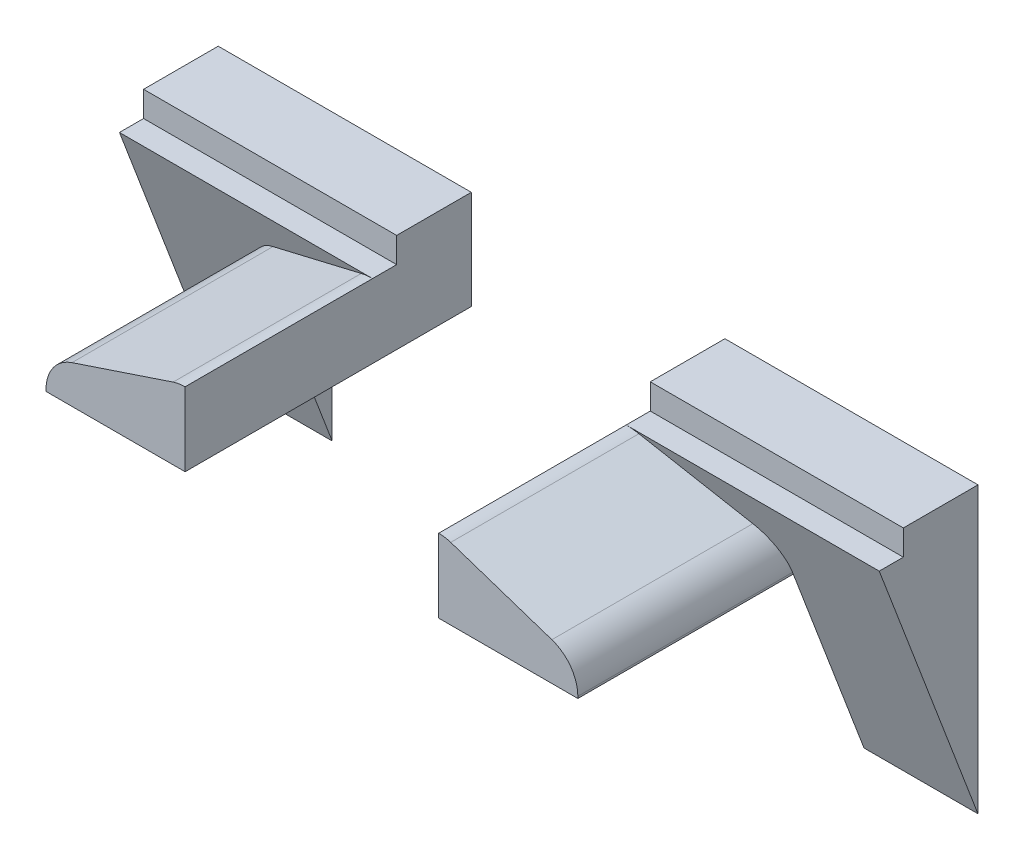
ISO-10303-21;
HEADER;
FILE_DESCRIPTION(('STEP AP214'),'2;1');
FILE_NAME('part.step','',(''),(''),'','','');
FILE_SCHEMA(('AUTOMOTIVE_DESIGN { 1 0 10303 214 1 1 1 1 }'));
ENDSEC;
DATA;
#1=APPLICATION_CONTEXT('core data for automotive mechanical design processes');
#2=APPLICATION_PROTOCOL_DEFINITION('international standard','automotive_design',2000,#1);
#3=PRODUCT_CONTEXT('',#1,'mechanical');
#4=PRODUCT('Part','Part','',(#3));
#5=PRODUCT_RELATED_PRODUCT_CATEGORY('part','',(#4));
#6=PRODUCT_DEFINITION_FORMATION('','',#4);
#7=PRODUCT_DEFINITION_CONTEXT('part definition',#1,'design');
#8=PRODUCT_DEFINITION('design','',#6,#7);
#9=PRODUCT_DEFINITION_SHAPE('','',#8);
#10=(LENGTH_UNIT() NAMED_UNIT(*) SI_UNIT(.MILLI.,.METRE.));
#11=(NAMED_UNIT(*) PLANE_ANGLE_UNIT() SI_UNIT($,.RADIAN.));
#12=(NAMED_UNIT(*) SI_UNIT($,.STERADIAN.) SOLID_ANGLE_UNIT());
#13=UNCERTAINTY_MEASURE_WITH_UNIT(LENGTH_MEASURE(1.E-05),#10,'distance_accuracy_value','');
#14=(GEOMETRIC_REPRESENTATION_CONTEXT(3) GLOBAL_UNCERTAINTY_ASSIGNED_CONTEXT((#13)) GLOBAL_UNIT_ASSIGNED_CONTEXT((#10,
#11,#12)) REPRESENTATION_CONTEXT('',''));
#15=CARTESIAN_POINT('',(0.,0.,0.));
#16=DIRECTION('',(0.,0.,1.));
#17=DIRECTION('',(1.,0.,0.));
#18=AXIS2_PLACEMENT_3D('',#15,#16,#17);
#19=CARTESIAN_POINT('',(300.,250.,226.));
#20=DIRECTION('',(0.,0.,-1.));
#21=DIRECTION('',(-1.,0.,0.));
#22=AXIS2_PLACEMENT_3D('',#19,#20,#21);
#23=PLANE('',#22);
#24=DIRECTION('',(1.,0.,0.));
#25=VECTOR('',#24,1.);
#26=CARTESIAN_POINT('',(210.,-53.1314680617709,226.));
#27=LINE('',#26,#25);
#28=CARTESIAN_POINT('',(-210.,-53.1314680617709,226.));
#29=VERTEX_POINT('',#28);
#30=CARTESIAN_POINT('',(-100.131670194949,-53.1314680617709,226.));
#31=VERTEX_POINT('',#30);
#32=EDGE_CURVE('E157',#29,#31,#27,.T.);
#33=ORIENTED_EDGE('',*,*,#32,.T.);
#34=DIRECTION('',(0.,1.,0.));
#35=VECTOR('',#34,1.);
#36=CARTESIAN_POINT('',(-100.131670194949,-14.05,226.));
#37=LINE('',#36,#35);
#38=CARTESIAN_POINT('',(-100.131670194949,4.99999999999998,226.));
#39=VERTEX_POINT('',#38);
#40=EDGE_CURVE('E65',#31,#39,#37,.T.);
#41=ORIENTED_EDGE('',*,*,#40,.T.);
#42=CARTESIAN_POINT('',(-100.131670194949,-25.,226.));
#43=DIRECTION('',(0.,0.,-1.));
#44=DIRECTION('',(-1.,0.,0.));
#45=AXIS2_PLACEMENT_3D('',#42,#43,#44);
#46=CIRCLE('',#45,30.);
#47=CARTESIAN_POINT('',(-109.618503175454,3.46049894151539,226.));
#48=VERTEX_POINT('',#47);
#49=EDGE_CURVE('E188',#48,#39,#46,.T.);
#50=ORIENTED_EDGE('',*,*,#49,.F.);
#51=DIRECTION('',(0.948683298050514,0.316227766016838,0.));
#52=VECTOR('',#51,1.);
#53=CARTESIAN_POINT('',(-105.,4.99999999999998,226.));
#54=LINE('',#53,#52);
#55=CARTESIAN_POINT('',(-189.486832980505,-23.1622776601684,226.));
#56=VERTEX_POINT('',#55);
#57=EDGE_CURVE('E182',#56,#48,#54,.T.);
#58=ORIENTED_EDGE('',*,*,#57,.F.);
#59=CARTESIAN_POINT('',(-180.,-51.6227766016838,226.));
#60=DIRECTION('',(0.,0.,-1.));
#61=DIRECTION('',(-1.,0.,0.));
#62=AXIS2_PLACEMENT_3D('',#59,#60,#61);
#63=CIRCLE('',#62,30.);
#64=CARTESIAN_POINT('',(-210.,-51.6227766016838,226.));
#65=VERTEX_POINT('',#64);
#66=EDGE_CURVE('E196',#65,#56,#63,.T.);
#67=ORIENTED_EDGE('',*,*,#66,.F.);
#68=DIRECTION('',(0.,-1.,0.));
#69=VECTOR('',#68,1.);
#70=CARTESIAN_POINT('',(-210.,0.,226.));
#71=LINE('',#70,#69);
#72=EDGE_CURVE('E131',#65,#29,#71,.T.);
#73=ORIENTED_EDGE('',*,*,#72,.T.);
#74=EDGE_LOOP('',(#33,#41,#50,#58,#67,#73));
#75=FACE_BOUND('',#74,.T.);
#76=ADVANCED_FACE('F43',(#75),#23,.F.);
#77=CARTESIAN_POINT('',(0.,0.,0.));
#78=DIRECTION('',(0.,0.,-1.));
#79=DIRECTION('',(-1.,0.,0.));
#80=AXIS2_PLACEMENT_3D('',#77,#78,#79);
#81=PLANE('',#80);
#82=DIRECTION('',(0.,-1.,0.));
#83=VECTOR('',#82,1.);
#84=CARTESIAN_POINT('',(-100.131670194949,-14.05,0.));
#85=LINE('',#84,#83);
#86=CARTESIAN_POINT('',(-100.131670194949,25.0000000000001,0.));
#87=VERTEX_POINT('',#86);
#88=CARTESIAN_POINT('',(-100.131670194949,-53.1314680617709,0.));
#89=VERTEX_POINT('',#88);
#90=EDGE_CURVE('E122',#87,#89,#85,.T.);
#91=ORIENTED_EDGE('',*,*,#90,.T.);
#92=DIRECTION('',(-1.,0.,0.));
#93=VECTOR('',#92,1.);
#94=CARTESIAN_POINT('',(210.,-53.1314680617709,0.));
#95=LINE('',#94,#93);
#96=CARTESIAN_POINT('',(-210.,-53.1314680617709,0.));
#97=VERTEX_POINT('',#96);
#98=EDGE_CURVE('E130',#89,#97,#95,.T.);
#99=ORIENTED_EDGE('',*,*,#98,.T.);
#100=DIRECTION('',(0.,-1.,0.));
#101=VECTOR('',#100,1.);
#102=CARTESIAN_POINT('',(-210.,-53.1314680617709,0.));
#103=LINE('',#102,#101);
#104=CARTESIAN_POINT('',(-210.,-200.,0.));
#105=VERTEX_POINT('',#104);
#106=EDGE_CURVE('E160',#97,#105,#103,.T.);
#107=ORIENTED_EDGE('',*,*,#106,.T.);
#108=DIRECTION('',(1.,0.,0.));
#109=VECTOR('',#108,1.);
#110=CARTESIAN_POINT('',(-300.,-200.,0.));
#111=LINE('',#110,#109);
#112=CARTESIAN_POINT('',(-300.,-200.,0.));
#113=VERTEX_POINT('',#112);
#114=EDGE_CURVE('E141',#113,#105,#111,.T.);
#115=ORIENTED_EDGE('',*,*,#114,.F.);
#116=DIRECTION('',(0.,-1.,0.));
#117=VECTOR('',#116,1.);
#118=CARTESIAN_POINT('',(-300.,-250.,0.));
#119=LINE('',#118,#117);
#120=CARTESIAN_POINT('',(-300.,25.0000000000001,0.));
#121=VERTEX_POINT('',#120);
#122=EDGE_CURVE('E147',#121,#113,#119,.T.);
#123=ORIENTED_EDGE('',*,*,#122,.F.);
#124=DIRECTION('',(-1.,0.,0.));
#125=VECTOR('',#124,1.);
#126=CARTESIAN_POINT('',(-300.,25.0000000000001,0.));
#127=LINE('',#126,#125);
#128=EDGE_CURVE('E137',#87,#121,#127,.T.);
#129=ORIENTED_EDGE('',*,*,#128,.F.);
#130=EDGE_LOOP('',(#91,#99,#107,#115,#123,#129));
#131=FACE_BOUND('',#130,.T.);
#132=ADVANCED_FACE('F144',(#131),#81,.T.);
#133=CARTESIAN_POINT('',(210.,-53.1314680617709,423.78807185347));
#134=DIRECTION('',(0.,-1.,0.));
#135=DIRECTION('',(0.,0.,-1.));
#136=AXIS2_PLACEMENT_3D('',#133,#134,#135);
#137=PLANE('',#136);
#138=DIRECTION('',(0.,0.,1.));
#139=VECTOR('',#138,1.);
#140=CARTESIAN_POINT('',(-100.131670194949,-53.1314680617709,0.));
#141=LINE('',#140,#139);
#142=EDGE_CURVE('E59',#89,#31,#141,.T.);
#143=ORIENTED_EDGE('',*,*,#142,.T.);
#144=ORIENTED_EDGE('',*,*,#32,.F.);
#145=DIRECTION('',(0.,0.,-1.));
#146=VECTOR('',#145,1.);
#147=CARTESIAN_POINT('',(-210.,-53.1314680617709,423.78807185347));
#148=LINE('',#147,#146);
#149=CARTESIAN_POINT('',(-210.,-53.131468061771,55.8816853228384));
#150=VERTEX_POINT('',#149);
#151=EDGE_CURVE('E166',#29,#150,#148,.T.);
#152=ORIENTED_EDGE('',*,*,#151,.T.);
#153=EDGE_CURVE('E153',#150,#97,#148,.T.);
#154=ORIENTED_EDGE('',*,*,#153,.T.);
#155=ORIENTED_EDGE('',*,*,#98,.F.);
#156=EDGE_LOOP('',(#143,#144,#152,#154,#155));
#157=FACE_BOUND('',#156,.T.);
#158=ADVANCED_FACE('F234',(#157),#137,.T.);
#159=CARTESIAN_POINT('',(-300.,25.0000000000001,886.018939122204));
#160=DIRECTION('',(0.,-1.,0.));
#161=DIRECTION('',(0.,0.,-1.));
#162=AXIS2_PLACEMENT_3D('',#159,#160,#161);
#163=PLANE('',#162);
#164=DIRECTION('',(1.,0.,0.));
#165=VECTOR('',#164,1.);
#166=CARTESIAN_POINT('',(-300.,25.0000000000001,58.9500000000001));
#167=LINE('',#166,#165);
#168=CARTESIAN_POINT('',(-300.,25.0000000000001,58.95));
#169=VERTEX_POINT('',#168);
#170=CARTESIAN_POINT('',(-100.131670194949,25.0000000000001,58.9500000000001));
#171=VERTEX_POINT('',#170);
#172=EDGE_CURVE('E139',#169,#171,#167,.T.);
#173=ORIENTED_EDGE('',*,*,#172,.T.);
#174=DIRECTION('',(0.,0.,1.));
#175=VECTOR('',#174,1.);
#176=CARTESIAN_POINT('',(-100.131670194949,25.0000000000001,0.));
#177=LINE('',#176,#175);
#178=EDGE_CURVE('E125',#87,#171,#177,.T.);
#179=ORIENTED_EDGE('',*,*,#178,.F.);
#180=ORIENTED_EDGE('',*,*,#128,.T.);
#181=DIRECTION('',(0.,0.,-1.));
#182=VECTOR('',#181,1.);
#183=CARTESIAN_POINT('',(-300.,25.0000000000001,886.018939122204));
#184=LINE('',#183,#182);
#185=EDGE_CURVE('E151',#169,#121,#184,.T.);
#186=ORIENTED_EDGE('',*,*,#185,.F.);
#187=EDGE_LOOP('',(#173,#179,#180,#186));
#188=FACE_BOUND('',#187,.T.);
#189=ADVANCED_FACE('F135',(#188),#163,.F.);
#190=CARTESIAN_POINT('',(0.,0.,58.95));
#191=DIRECTION('',(0.,0.,-1.));
#192=DIRECTION('',(-1.,0.,0.));
#193=AXIS2_PLACEMENT_3D('',#190,#191,#192);
#194=PLANE('',#193);
#195=DIRECTION('',(-1.,0.,0.));
#196=VECTOR('',#195,1.);
#197=CARTESIAN_POINT('',(-300.,5.0000000000001,58.95));
#198=LINE('',#197,#196);
#199=CARTESIAN_POINT('',(-100.131670194949,5.0000000000001,58.95));
#200=VERTEX_POINT('',#199);
#201=CARTESIAN_POINT('',(-300.,5.0000000000001,58.95));
#202=VERTEX_POINT('',#201);
#203=EDGE_CURVE('E46',#200,#202,#198,.T.);
#204=ORIENTED_EDGE('',*,*,#203,.F.);
#205=DIRECTION('',(0.,-1.,0.));
#206=VECTOR('',#205,1.);
#207=CARTESIAN_POINT('',(-100.131670194949,5.0000000000001,58.95));
#208=LINE('',#207,#206);
#209=EDGE_CURVE('E140',#171,#200,#208,.T.);
#210=ORIENTED_EDGE('',*,*,#209,.F.);
#211=ORIENTED_EDGE('',*,*,#172,.F.);
#212=DIRECTION('',(0.,1.,0.));
#213=VECTOR('',#212,1.);
#214=CARTESIAN_POINT('',(-300.,5.0000000000001,58.95));
#215=LINE('',#214,#213);
#216=EDGE_CURVE('E148',#202,#169,#215,.T.);
#217=ORIENTED_EDGE('',*,*,#216,.F.);
#218=EDGE_LOOP('',(#204,#210,#211,#217));
#219=FACE_BOUND('',#218,.T.);
#220=ADVANCED_FACE('F244',(#219),#194,.F.);
#221=CARTESIAN_POINT('',(-300.,-250.,886.018939122204));
#222=DIRECTION('',(1.,0.,0.));
#223=DIRECTION('',(0.,0.,-1.));
#224=AXIS2_PLACEMENT_3D('',#221,#222,#223);
#225=PLANE('',#224);
#226=DIRECTION('',(0.,0.,1.));
#227=VECTOR('',#226,1.);
#228=CARTESIAN_POINT('',(-300.,5.0000000000001,58.95));
#229=LINE('',#228,#227);
#230=CARTESIAN_POINT('',(-300.,5.0000000000001,78.));
#231=VERTEX_POINT('',#230);
#232=EDGE_CURVE('E171',#202,#231,#229,.T.);
#233=ORIENTED_EDGE('',*,*,#232,.F.);
#234=ORIENTED_EDGE('',*,*,#216,.T.);
#235=ORIENTED_EDGE('',*,*,#185,.T.);
#236=ORIENTED_EDGE('',*,*,#122,.T.);
#237=DIRECTION('',(0.,-0.934632107300073,-0.35561611887515));
#238=VECTOR('',#237,1.);
#239=CARTESIAN_POINT('',(-300.,-200.,0.));
#240=LINE('',#239,#238);
#241=EDGE_CURVE('E174',#231,#113,#240,.T.);
#242=ORIENTED_EDGE('',*,*,#241,.F.);
#243=EDGE_LOOP('',(#233,#234,#235,#236,#242));
#244=FACE_BOUND('',#243,.T.);
#245=ADVANCED_FACE('F246',(#244),#225,.F.);
#246=CARTESIAN_POINT('',(-210.,0.,226.));
#247=DIRECTION('',(1.,0.,0.));
#248=DIRECTION('',(0.,-1.,0.));
#249=AXIS2_PLACEMENT_3D('',#246,#247,#248);
#250=PLANE('',#249);
#251=ORIENTED_EDGE('',*,*,#151,.F.);
#252=ORIENTED_EDGE('',*,*,#72,.F.);
#253=DIRECTION('',(0.,0.,-1.));
#254=VECTOR('',#253,1.);
#255=CARTESIAN_POINT('',(-210.,-51.6227766016838,226.));
#256=LINE('',#255,#254);
#257=CARTESIAN_POINT('',(-210.,-51.6227766016838,56.4557240247252));
#258=VERTEX_POINT('',#257);
#259=EDGE_CURVE('E191',#258,#65,#256,.F.);
#260=ORIENTED_EDGE('',*,*,#259,.F.);
#261=DIRECTION('',(0.,-0.934632107300073,-0.35561611887515));
#262=VECTOR('',#261,1.);
#263=CARTESIAN_POINT('',(-210.,49.823110020994,95.0546467396953));
#264=LINE('',#263,#262);
#265=EDGE_CURVE('E185',#258,#150,#264,.T.);
#266=ORIENTED_EDGE('',*,*,#265,.T.);
#267=EDGE_LOOP('',(#251,#252,#260,#266));
#268=FACE_BOUND('',#267,.T.);
#269=ADVANCED_FACE('F231',(#268),#250,.F.);
#270=CARTESIAN_POINT('',(-100.131670194949,-25.,226.));
#271=DIRECTION('',(0.,0.,1.));
#272=DIRECTION('',(1.,0.,0.));
#273=AXIS2_PLACEMENT_3D('',#270,#271,#272);
#274=CYLINDRICAL_SURFACE('',#273,30.);
#275=ORIENTED_EDGE('',*,*,#49,.T.);
#276=DIRECTION('',(0.,0.,-1.));
#277=VECTOR('',#276,1.);
#278=CARTESIAN_POINT('',(-100.131670194949,4.99999999999998,78.));
#279=LINE('',#278,#277);
#280=CARTESIAN_POINT('',(-100.131670194949,5.00000000000005,78.0000000000001));
#281=VERTEX_POINT('',#280);
#282=EDGE_CURVE('E203',#39,#281,#279,.T.);
#283=ORIENTED_EDGE('',*,*,#282,.T.);
#284=CARTESIAN_POINT('',(-100.131670194949,-25.,66.5853658536585));
#285=DIRECTION('',(0.,-0.35561611887515,0.934632107300073));
#286=DIRECTION('',(0.,0.934632107300073,0.35561611887515));
#287=AXIS2_PLACEMENT_3D('',#284,#285,#286);
#288=ELLIPSE('',#287,32.0981911125039,30.);
#289=CARTESIAN_POINT('',(-109.618503175454,3.4604989415154,77.4142386216497));
#290=VERTEX_POINT('',#289);
#291=EDGE_CURVE('E197',#281,#290,#288,.T.);
#292=ORIENTED_EDGE('',*,*,#291,.T.);
#293=DIRECTION('',(0.,0.,-1.));
#294=VECTOR('',#293,1.);
#295=CARTESIAN_POINT('',(-109.618503175454,3.46049894151539,226.));
#296=LINE('',#295,#294);
#297=EDGE_CURVE('E194',#290,#48,#296,.F.);
#298=ORIENTED_EDGE('',*,*,#297,.T.);
#299=EDGE_LOOP('',(#275,#283,#292,#298));
#300=FACE_BOUND('',#299,.T.);
#301=ADVANCED_FACE('F216',(#300),#274,.T.);
#302=CARTESIAN_POINT('',(-180.,-51.6227766016838,226.));
#303=DIRECTION('',(0.,0.,-1.));
#304=DIRECTION('',(-1.,0.,0.));
#305=AXIS2_PLACEMENT_3D('',#302,#303,#304);
#306=CYLINDRICAL_SURFACE('',#305,30.);
#307=ORIENTED_EDGE('',*,*,#66,.T.);
#308=DIRECTION('',(0.,0.,-1.));
#309=VECTOR('',#308,1.);
#310=CARTESIAN_POINT('',(-189.486832980505,-23.1622776601684,226.));
#311=LINE('',#310,#309);
#312=CARTESIAN_POINT('',(-189.486832980505,-23.1622776601684,67.2845967927164));
#313=VERTEX_POINT('',#312);
#314=EDGE_CURVE('E198',#56,#313,#311,.T.);
#315=ORIENTED_EDGE('',*,*,#314,.T.);
#316=CARTESIAN_POINT('',(-180.,-51.6227766016838,56.4557240247251));
#317=DIRECTION('',(0.,-0.35561611887515,0.934632107300073));
#318=DIRECTION('',(0.,-0.934632107300073,-0.35561611887515));
#319=AXIS2_PLACEMENT_3D('',#316,#317,#318);
#320=ELLIPSE('',#319,32.0981911125039,30.);
#321=EDGE_CURVE('E201',#313,#258,#320,.T.);
#322=ORIENTED_EDGE('',*,*,#321,.T.);
#323=ORIENTED_EDGE('',*,*,#259,.T.);
#324=EDGE_LOOP('',(#307,#315,#322,#323));
#325=FACE_BOUND('',#324,.T.);
#326=ADVANCED_FACE('F226',(#325),#306,.T.);
#327=CARTESIAN_POINT('',(-105.,4.99999999999998,226.));
#328=DIRECTION('',(-0.316227766016838,0.948683298050514,0.));
#329=DIRECTION('',(0.948683298050514,0.316227766016838,0.));
#330=AXIS2_PLACEMENT_3D('',#327,#328,#329);
#331=PLANE('',#330);
#332=ORIENTED_EDGE('',*,*,#57,.T.);
#333=ORIENTED_EDGE('',*,*,#297,.F.);
#334=DIRECTION('',(0.94188988136698,0.313963293788993,0.119459204466056));
#335=VECTOR('',#334,1.);
#336=CARTESIAN_POINT('',(-88.3474224434364,10.5508591855212,80.1120342266861));
#337=LINE('',#336,#335);
#338=EDGE_CURVE('E177',#313,#290,#337,.T.);
#339=ORIENTED_EDGE('',*,*,#338,.F.);
#340=ORIENTED_EDGE('',*,*,#314,.F.);
#341=EDGE_LOOP('',(#332,#333,#339,#340));
#342=FACE_BOUND('',#341,.T.);
#343=ADVANCED_FACE('F222',(#342),#331,.T.);
#344=CARTESIAN_POINT('',(-300.,-200.,0.));
#345=DIRECTION('',(0.,-0.35561611887515,0.934632107300073));
#346=DIRECTION('',(0.,0.934632107300073,0.35561611887515));
#347=AXIS2_PLACEMENT_3D('',#344,#345,#346);
#348=PLANE('',#347);
#349=ORIENTED_EDGE('',*,*,#338,.T.);
#350=ORIENTED_EDGE('',*,*,#291,.F.);
#351=DIRECTION('',(1.,0.,0.));
#352=VECTOR('',#351,1.);
#353=CARTESIAN_POINT('',(-300.,5.0000000000001,78.));
#354=LINE('',#353,#352);
#355=EDGE_CURVE('E51',#231,#281,#354,.T.);
#356=ORIENTED_EDGE('',*,*,#355,.F.);
#357=ORIENTED_EDGE('',*,*,#241,.T.);
#358=ORIENTED_EDGE('',*,*,#114,.T.);
#359=EDGE_CURVE('E173',#150,#105,#264,.T.);
#360=ORIENTED_EDGE('',*,*,#359,.F.);
#361=ORIENTED_EDGE('',*,*,#265,.F.);
#362=ORIENTED_EDGE('',*,*,#321,.F.);
#363=EDGE_LOOP('',(#349,#350,#356,#357,#358,#360,#361,#362));
#364=FACE_BOUND('',#363,.T.);
#365=ADVANCED_FACE('F269',(#364),#348,.T.);
#366=CARTESIAN_POINT('',(-100.131670194949,-14.05,427.167363168382));
#367=DIRECTION('',(1.,0.,0.));
#368=DIRECTION('',(0.,0.,-1.));
#369=AXIS2_PLACEMENT_3D('',#366,#367,#368);
#370=PLANE('',#369);
#371=ORIENTED_EDGE('',*,*,#40,.F.);
#372=ORIENTED_EDGE('',*,*,#142,.F.);
#373=ORIENTED_EDGE('',*,*,#90,.F.);
#374=ORIENTED_EDGE('',*,*,#178,.T.);
#375=ORIENTED_EDGE('',*,*,#209,.T.);
#376=DIRECTION('',(0.,0.,-1.));
#377=VECTOR('',#376,1.);
#378=CARTESIAN_POINT('',(-100.131670194949,4.99999999999998,427.167363168382));
#379=LINE('',#378,#377);
#380=EDGE_CURVE('E12',#281,#200,#379,.T.);
#381=ORIENTED_EDGE('',*,*,#380,.F.);
#382=ORIENTED_EDGE('',*,*,#282,.F.);
#383=EDGE_LOOP('',(#371,#372,#373,#374,#375,#381,#382));
#384=FACE_BOUND('',#383,.T.);
#385=ADVANCED_FACE('F124',(#384),#370,.T.);
#386=CARTESIAN_POINT('',(-210.,-53.1314680617709,423.78807185347));
#387=DIRECTION('',(1.,0.,0.));
#388=DIRECTION('',(0.,1.,0.));
#389=AXIS2_PLACEMENT_3D('',#386,#387,#388);
#390=PLANE('',#389);
#391=ORIENTED_EDGE('',*,*,#106,.F.);
#392=ORIENTED_EDGE('',*,*,#153,.F.);
#393=ORIENTED_EDGE('',*,*,#359,.T.);
#394=EDGE_LOOP('',(#391,#392,#393));
#395=FACE_BOUND('',#394,.T.);
#396=ADVANCED_FACE('F236',(#395),#390,.T.);
#397=CARTESIAN_POINT('',(-300.,5.0000000000001,58.95));
#398=DIRECTION('',(0.,1.,0.));
#399=DIRECTION('',(0.,0.,-1.));
#400=AXIS2_PLACEMENT_3D('',#397,#398,#399);
#401=PLANE('',#400);
#402=ORIENTED_EDGE('',*,*,#203,.T.);
#403=ORIENTED_EDGE('',*,*,#232,.T.);
#404=ORIENTED_EDGE('',*,*,#355,.T.);
#405=ORIENTED_EDGE('',*,*,#380,.T.);
#406=EDGE_LOOP('',(#402,#403,#404,#405));
#407=FACE_BOUND('',#406,.T.);
#408=ADVANCED_FACE('F240',(#407),#401,.T.);
#409=CLOSED_SHELL('',(#76,#132,#158,#189,#220,#245,#269,#301,#326,#343,#365,#385,#396,#408));
#410=MANIFOLD_SOLID_BREP('B2',#409);
#411=CARTESIAN_POINT('',(105.,4.99999999999998,226.));
#412=DIRECTION('',(0.316227766016838,0.948683298050514,0.));
#413=DIRECTION('',(0.948683298050514,-0.316227766016838,0.));
#414=AXIS2_PLACEMENT_3D('',#411,#412,#413);
#415=PLANE('',#414);
#416=DIRECTION('',(0.94188988136698,-0.313963293788994,-0.119459204466056));
#417=VECTOR('',#416,1.);
#418=CARTESIAN_POINT('',(88.3474224434364,10.5508591855212,80.1120342266861));
#419=LINE('',#418,#417);
#420=CARTESIAN_POINT('',(109.618503175454,3.46049894151539,77.4142386216497));
#421=VERTEX_POINT('',#420);
#422=CARTESIAN_POINT('',(189.486832980505,-23.1622776601684,67.2845967927164));
#423=VERTEX_POINT('',#422);
#424=EDGE_CURVE('E442',#421,#423,#419,.T.);
#425=ORIENTED_EDGE('',*,*,#424,.F.);
#426=DIRECTION('',(0.,0.,-1.));
#427=VECTOR('',#426,1.);
#428=CARTESIAN_POINT('',(109.618503175454,3.46049894151539,78.));
#429=LINE('',#428,#427);
#430=CARTESIAN_POINT('',(109.618503175454,3.46049894151539,226.));
#431=VERTEX_POINT('',#430);
#432=EDGE_CURVE('E464',#431,#421,#429,.T.);
#433=ORIENTED_EDGE('',*,*,#432,.F.);
#434=DIRECTION('',(0.948683298050514,-0.316227766016838,0.));
#435=VECTOR('',#434,1.);
#436=CARTESIAN_POINT('',(105.,4.99999999999998,226.));
#437=LINE('',#436,#435);
#438=CARTESIAN_POINT('',(189.486832980505,-23.1622776601684,226.));
#439=VERTEX_POINT('',#438);
#440=EDGE_CURVE('E478',#431,#439,#437,.T.);
#441=ORIENTED_EDGE('',*,*,#440,.T.);
#442=DIRECTION('',(0.,0.,-1.));
#443=VECTOR('',#442,1.);
#444=CARTESIAN_POINT('',(189.486832980505,-23.1622776601684,226.));
#445=LINE('',#444,#443);
#446=EDGE_CURVE('E473',#423,#439,#445,.F.);
#447=ORIENTED_EDGE('',*,*,#446,.F.);
#448=EDGE_LOOP('',(#425,#433,#441,#447));
#449=FACE_BOUND('',#448,.T.);
#450=ADVANCED_FACE('F376',(#449),#415,.T.);
#451=CARTESIAN_POINT('',(180.,-51.6227766016838,226.));
#452=DIRECTION('',(0.,0.,1.));
#453=DIRECTION('',(1.,0.,0.));
#454=AXIS2_PLACEMENT_3D('',#451,#452,#453);
#455=CYLINDRICAL_SURFACE('',#454,30.);
#456=CARTESIAN_POINT('',(180.,-51.6227766016838,226.));
#457=DIRECTION('',(0.,0.,-1.));
#458=DIRECTION('',(-1.,0.,0.));
#459=AXIS2_PLACEMENT_3D('',#456,#457,#458);
#460=CIRCLE('',#459,30.);
#461=CARTESIAN_POINT('',(210.,-51.6227766016838,226.));
#462=VERTEX_POINT('',#461);
#463=EDGE_CURVE('E467',#439,#462,#460,.T.);
#464=ORIENTED_EDGE('',*,*,#463,.T.);
#465=DIRECTION('',(0.,0.,-1.));
#466=VECTOR('',#465,1.);
#467=CARTESIAN_POINT('',(210.,-51.6227766016838,64.6829268292683));
#468=LINE('',#467,#466);
#469=CARTESIAN_POINT('',(210.,-51.6227766016839,56.4557240247252));
#470=VERTEX_POINT('',#469);
#471=EDGE_CURVE('E469',#462,#470,#468,.T.);
#472=ORIENTED_EDGE('',*,*,#471,.T.);
#473=CARTESIAN_POINT('',(180.,-51.6227766016838,56.4557240247251));
#474=DIRECTION('',(0.,-0.35561611887515,0.934632107300073));
#475=DIRECTION('',(0.,0.934632107300073,0.35561611887515));
#476=AXIS2_PLACEMENT_3D('',#473,#474,#475);
#477=ELLIPSE('',#476,32.0981911125039,30.);
#478=EDGE_CURVE('E470',#470,#423,#477,.T.);
#479=ORIENTED_EDGE('',*,*,#478,.T.);
#480=ORIENTED_EDGE('',*,*,#446,.T.);
#481=EDGE_LOOP('',(#464,#472,#479,#480));
#482=FACE_BOUND('',#481,.T.);
#483=ADVANCED_FACE('F561',(#482),#455,.T.);
#484=CARTESIAN_POINT('',(-300.,-200.,0.));
#485=DIRECTION('',(0.,-0.35561611887515,0.934632107300073));
#486=DIRECTION('',(0.,0.934632107300073,0.35561611887515));
#487=AXIS2_PLACEMENT_3D('',#484,#485,#486);
#488=PLANE('',#487);
#489=ORIENTED_EDGE('',*,*,#424,.T.);
#490=ORIENTED_EDGE('',*,*,#478,.F.);
#491=DIRECTION('',(0.,-0.934632107300073,-0.35561611887515));
#492=VECTOR('',#491,1.);
#493=CARTESIAN_POINT('',(210.,49.823110020994,95.0546467396953));
#494=LINE('',#493,#492);
#495=CARTESIAN_POINT('',(210.,-53.1314680617709,55.8816853228384));
#496=VERTEX_POINT('',#495);
#497=EDGE_CURVE('E385',#470,#496,#494,.T.);
#498=ORIENTED_EDGE('',*,*,#497,.T.);
#499=CARTESIAN_POINT('',(210.,-200.,0.));
#500=VERTEX_POINT('',#499);
#501=EDGE_CURVE('E426',#496,#500,#494,.T.);
#502=ORIENTED_EDGE('',*,*,#501,.T.);
#503=DIRECTION('',(1.,0.,0.));
#504=VECTOR('',#503,1.);
#505=CARTESIAN_POINT('',(-300.,-200.,0.));
#506=LINE('',#505,#504);
#507=CARTESIAN_POINT('',(300.,-200.,0.));
#508=VERTEX_POINT('',#507);
#509=EDGE_CURVE('E41',#500,#508,#506,.T.);
#510=ORIENTED_EDGE('',*,*,#509,.T.);
#511=DIRECTION('',(0.,-0.934632107300073,-0.35561611887515));
#512=VECTOR('',#511,1.);
#513=CARTESIAN_POINT('',(300.,-200.,0.));
#514=LINE('',#513,#512);
#515=CARTESIAN_POINT('',(300.,5.0000000000001,78.));
#516=VERTEX_POINT('',#515);
#517=EDGE_CURVE('E380',#516,#508,#514,.T.);
#518=ORIENTED_EDGE('',*,*,#517,.F.);
#519=DIRECTION('',(1.,0.,0.));
#520=VECTOR('',#519,1.);
#521=CARTESIAN_POINT('',(-300.,5.0000000000001,78.));
#522=LINE('',#521,#520);
#523=CARTESIAN_POINT('',(100.131670194949,5.0000000000001,78.));
#524=VERTEX_POINT('',#523);
#525=EDGE_CURVE('E485',#524,#516,#522,.T.);
#526=ORIENTED_EDGE('',*,*,#525,.F.);
#527=CARTESIAN_POINT('',(100.131670194949,-25.,66.5853658536585));
#528=DIRECTION('',(0.,-0.35561611887515,0.934632107300073));
#529=DIRECTION('',(0.,0.934632107300073,0.35561611887515));
#530=AXIS2_PLACEMENT_3D('',#527,#528,#529);
#531=ELLIPSE('',#530,32.0981911125039,30.);
#532=EDGE_CURVE('E402',#421,#524,#531,.T.);
#533=ORIENTED_EDGE('',*,*,#532,.F.);
#534=EDGE_LOOP('',(#489,#490,#498,#502,#510,#518,#526,#533));
#535=FACE_BOUND('',#534,.T.);
#536=ADVANCED_FACE('F438',(#535),#488,.T.);
#537=CARTESIAN_POINT('',(300.,-250.,886.018939122204));
#538=DIRECTION('',(-1.,0.,0.));
#539=DIRECTION('',(0.,-1.,0.));
#540=AXIS2_PLACEMENT_3D('',#537,#538,#539);
#541=PLANE('',#540);
#542=DIRECTION('',(0.,0.,1.));
#543=VECTOR('',#542,1.);
#544=CARTESIAN_POINT('',(300.,5.0000000000001,58.95));
#545=LINE('',#544,#543);
#546=CARTESIAN_POINT('',(300.,5.0000000000001,58.95));
#547=VERTEX_POINT('',#546);
#548=EDGE_CURVE('E497',#547,#516,#545,.T.);
#549=ORIENTED_EDGE('',*,*,#548,.T.);
#550=ORIENTED_EDGE('',*,*,#517,.T.);
#551=DIRECTION('',(0.,1.,0.));
#552=VECTOR('',#551,1.);
#553=CARTESIAN_POINT('',(300.,-250.,0.));
#554=LINE('',#553,#552);
#555=CARTESIAN_POINT('',(300.,25.0000000000001,0.));
#556=VERTEX_POINT('',#555);
#557=EDGE_CURVE('E448',#508,#556,#554,.T.);
#558=ORIENTED_EDGE('',*,*,#557,.T.);
#559=DIRECTION('',(0.,0.,-1.));
#560=VECTOR('',#559,1.);
#561=CARTESIAN_POINT('',(300.,25.0000000000001,886.018939122204));
#562=LINE('',#561,#560);
#563=CARTESIAN_POINT('',(300.,25.0000000000001,58.95));
#564=VERTEX_POINT('',#563);
#565=EDGE_CURVE('E454',#564,#556,#562,.T.);
#566=ORIENTED_EDGE('',*,*,#565,.F.);
#567=DIRECTION('',(0.,-1.,0.));
#568=VECTOR('',#567,1.);
#569=CARTESIAN_POINT('',(300.,5.0000000000001,58.95));
#570=LINE('',#569,#568);
#571=EDGE_CURVE('E507',#564,#547,#570,.T.);
#572=ORIENTED_EDGE('',*,*,#571,.T.);
#573=EDGE_LOOP('',(#549,#550,#558,#566,#572));
#574=FACE_BOUND('',#573,.T.);
#575=ADVANCED_FACE('F378',(#574),#541,.F.);
#576=CARTESIAN_POINT('',(-300.,25.0000000000001,886.018939122204));
#577=DIRECTION('',(0.,-1.,0.));
#578=DIRECTION('',(0.,0.,-1.));
#579=AXIS2_PLACEMENT_3D('',#576,#577,#578);
#580=PLANE('',#579);
#581=DIRECTION('',(-1.,0.,0.));
#582=VECTOR('',#581,1.);
#583=CARTESIAN_POINT('',(-300.,25.0000000000001,0.));
#584=LINE('',#583,#582);
#585=CARTESIAN_POINT('',(100.131670194949,25.0000000000001,0.));
#586=VERTEX_POINT('',#585);
#587=EDGE_CURVE('E451',#556,#586,#584,.T.);
#588=ORIENTED_EDGE('',*,*,#587,.T.);
#589=DIRECTION('',(0.,0.,1.));
#590=VECTOR('',#589,1.);
#591=CARTESIAN_POINT('',(100.131670194949,25.0000000000001,0.));
#592=LINE('',#591,#590);
#593=CARTESIAN_POINT('',(100.131670194949,25.0000000000001,58.95));
#594=VERTEX_POINT('',#593);
#595=EDGE_CURVE('E571',#586,#594,#592,.T.);
#596=ORIENTED_EDGE('',*,*,#595,.T.);
#597=DIRECTION('',(1.,0.,0.));
#598=VECTOR('',#597,1.);
#599=CARTESIAN_POINT('',(-300.,25.0000000000001,58.9500000000001));
#600=LINE('',#599,#598);
#601=EDGE_CURVE('E435',#594,#564,#600,.T.);
#602=ORIENTED_EDGE('',*,*,#601,.T.);
#603=ORIENTED_EDGE('',*,*,#565,.T.);
#604=EDGE_LOOP('',(#588,#596,#602,#603));
#605=FACE_BOUND('',#604,.T.);
#606=ADVANCED_FACE('F574',(#605),#580,.F.);
#607=CARTESIAN_POINT('',(0.,0.,58.95));
#608=DIRECTION('',(0.,0.,-1.));
#609=DIRECTION('',(-1.,0.,0.));
#610=AXIS2_PLACEMENT_3D('',#607,#608,#609);
#611=PLANE('',#610);
#612=ORIENTED_EDGE('',*,*,#601,.F.);
#613=DIRECTION('',(0.,1.,0.));
#614=VECTOR('',#613,1.);
#615=CARTESIAN_POINT('',(100.131670194949,5.0000000000001,58.95));
#616=LINE('',#615,#614);
#617=CARTESIAN_POINT('',(100.131670194949,5.0000000000001,58.95));
#618=VERTEX_POINT('',#617);
#619=EDGE_CURVE('E530',#618,#594,#616,.T.);
#620=ORIENTED_EDGE('',*,*,#619,.F.);
#621=DIRECTION('',(-1.,0.,0.));
#622=VECTOR('',#621,1.);
#623=CARTESIAN_POINT('',(-300.,5.0000000000001,58.95));
#624=LINE('',#623,#622);
#625=EDGE_CURVE('E508',#547,#618,#624,.T.);
#626=ORIENTED_EDGE('',*,*,#625,.F.);
#627=ORIENTED_EDGE('',*,*,#571,.F.);
#628=EDGE_LOOP('',(#612,#620,#626,#627));
#629=FACE_BOUND('',#628,.T.);
#630=ADVANCED_FACE('F575',(#629),#611,.F.);
#631=CARTESIAN_POINT('',(-300.,5.0000000000001,58.95));
#632=DIRECTION('',(0.,1.,0.));
#633=DIRECTION('',(0.,0.,-1.));
#634=AXIS2_PLACEMENT_3D('',#631,#632,#633);
#635=PLANE('',#634);
#636=ORIENTED_EDGE('',*,*,#525,.T.);
#637=ORIENTED_EDGE('',*,*,#548,.F.);
#638=ORIENTED_EDGE('',*,*,#625,.T.);
#639=DIRECTION('',(0.,0.,-1.));
#640=VECTOR('',#639,1.);
#641=CARTESIAN_POINT('',(100.131670194949,4.99999999999998,427.167363168382));
#642=LINE('',#641,#640);
#643=EDGE_CURVE('E501',#524,#618,#642,.T.);
#644=ORIENTED_EDGE('',*,*,#643,.F.);
#645=EDGE_LOOP('',(#636,#637,#638,#644));
#646=FACE_BOUND('',#645,.T.);
#647=ADVANCED_FACE('F494',(#646),#635,.T.);
#648=CARTESIAN_POINT('',(100.131670194949,-25.,226.));
#649=DIRECTION('',(0.,0.,1.));
#650=DIRECTION('',(1.,0.,0.));
#651=AXIS2_PLACEMENT_3D('',#648,#649,#650);
#652=CYLINDRICAL_SURFACE('',#651,30.);
#653=CARTESIAN_POINT('',(100.131670194949,-25.,226.));
#654=DIRECTION('',(0.,0.,-1.));
#655=DIRECTION('',(-1.,0.,0.));
#656=AXIS2_PLACEMENT_3D('',#653,#654,#655);
#657=CIRCLE('',#656,30.);
#658=CARTESIAN_POINT('',(100.131670194949,4.99999999999998,226.));
#659=VERTEX_POINT('',#658);
#660=EDGE_CURVE('E461',#659,#431,#657,.T.);
#661=ORIENTED_EDGE('',*,*,#660,.T.);
#662=ORIENTED_EDGE('',*,*,#432,.T.);
#663=ORIENTED_EDGE('',*,*,#532,.T.);
#664=DIRECTION('',(0.,0.,-1.));
#665=VECTOR('',#664,1.);
#666=CARTESIAN_POINT('',(100.131670194949,4.99999999999998,226.));
#667=LINE('',#666,#665);
#668=EDGE_CURVE('E466',#524,#659,#667,.F.);
#669=ORIENTED_EDGE('',*,*,#668,.T.);
#670=EDGE_LOOP('',(#661,#662,#663,#669));
#671=FACE_BOUND('',#670,.T.);
#672=ADVANCED_FACE('F550',(#671),#652,.T.);
#673=CARTESIAN_POINT('',(210.,0.,226.));
#674=DIRECTION('',(1.,0.,0.));
#675=DIRECTION('',(0.,0.,-1.));
#676=AXIS2_PLACEMENT_3D('',#673,#674,#675);
#677=PLANE('',#676);
#678=DIRECTION('',(0.,-1.,0.));
#679=VECTOR('',#678,1.);
#680=CARTESIAN_POINT('',(210.,0.,226.));
#681=LINE('',#680,#679);
#682=CARTESIAN_POINT('',(210.,-53.1314680617709,226.));
#683=VERTEX_POINT('',#682);
#684=EDGE_CURVE('E482',#462,#683,#681,.T.);
#685=ORIENTED_EDGE('',*,*,#684,.T.);
#686=DIRECTION('',(0.,0.,-1.));
#687=VECTOR('',#686,1.);
#688=CARTESIAN_POINT('',(210.,-53.1314680617709,423.78807185347));
#689=LINE('',#688,#687);
#690=EDGE_CURVE('E517',#683,#496,#689,.T.);
#691=ORIENTED_EDGE('',*,*,#690,.T.);
#692=ORIENTED_EDGE('',*,*,#497,.F.);
#693=ORIENTED_EDGE('',*,*,#471,.F.);
#694=EDGE_LOOP('',(#685,#691,#692,#693));
#695=FACE_BOUND('',#694,.T.);
#696=ADVANCED_FACE('F563',(#695),#677,.T.);
#697=CARTESIAN_POINT('',(210.,-250.,423.78807185347));
#698=DIRECTION('',(-1.,0.,0.));
#699=DIRECTION('',(0.,0.,1.));
#700=AXIS2_PLACEMENT_3D('',#697,#698,#699);
#701=PLANE('',#700);
#702=CARTESIAN_POINT('',(210.,-53.1314680617709,0.));
#703=VERTEX_POINT('',#702);
#704=EDGE_CURVE('E429',#496,#703,#689,.T.);
#705=ORIENTED_EDGE('',*,*,#704,.T.);
#706=DIRECTION('',(0.,1.,0.));
#707=VECTOR('',#706,1.);
#708=CARTESIAN_POINT('',(210.,-250.,0.));
#709=LINE('',#708,#707);
#710=EDGE_CURVE('E422',#500,#703,#709,.T.);
#711=ORIENTED_EDGE('',*,*,#710,.F.);
#712=ORIENTED_EDGE('',*,*,#501,.F.);
#713=EDGE_LOOP('',(#705,#711,#712));
#714=FACE_BOUND('',#713,.T.);
#715=ADVANCED_FACE('F424',(#714),#701,.T.);
#716=CARTESIAN_POINT('',(210.,-53.1314680617709,423.78807185347));
#717=DIRECTION('',(0.,-1.,0.));
#718=DIRECTION('',(0.,0.,-1.));
#719=AXIS2_PLACEMENT_3D('',#716,#717,#718);
#720=PLANE('',#719);
#721=DIRECTION('',(0.,0.,1.));
#722=VECTOR('',#721,1.);
#723=CARTESIAN_POINT('',(100.131670194949,-53.1314680617709,0.));
#724=LINE('',#723,#722);
#725=CARTESIAN_POINT('',(100.131670194949,-53.1314680617709,0.));
#726=VERTEX_POINT('',#725);
#727=CARTESIAN_POINT('',(100.131670194949,-53.1314680617709,226.));
#728=VERTEX_POINT('',#727);
#729=EDGE_CURVE('E569',#726,#728,#724,.T.);
#730=ORIENTED_EDGE('',*,*,#729,.F.);
#731=DIRECTION('',(-1.,0.,0.));
#732=VECTOR('',#731,1.);
#733=CARTESIAN_POINT('',(210.,-53.1314680617709,0.));
#734=LINE('',#733,#732);
#735=EDGE_CURVE('E434',#703,#726,#734,.T.);
#736=ORIENTED_EDGE('',*,*,#735,.F.);
#737=ORIENTED_EDGE('',*,*,#704,.F.);
#738=ORIENTED_EDGE('',*,*,#690,.F.);
#739=DIRECTION('',(1.,0.,0.));
#740=VECTOR('',#739,1.);
#741=CARTESIAN_POINT('',(210.,-53.1314680617709,226.));
#742=LINE('',#741,#740);
#743=EDGE_CURVE('E515',#728,#683,#742,.T.);
#744=ORIENTED_EDGE('',*,*,#743,.F.);
#745=EDGE_LOOP('',(#730,#736,#737,#738,#744));
#746=FACE_BOUND('',#745,.T.);
#747=ADVANCED_FACE('F567',(#746),#720,.T.);
#748=CARTESIAN_POINT('',(100.131670194949,4.99999999999998,427.167363168382));
#749=DIRECTION('',(-1.,0.,0.));
#750=DIRECTION('',(0.,0.,1.));
#751=AXIS2_PLACEMENT_3D('',#748,#749,#750);
#752=PLANE('',#751);
#753=ORIENTED_EDGE('',*,*,#668,.F.);
#754=ORIENTED_EDGE('',*,*,#643,.T.);
#755=ORIENTED_EDGE('',*,*,#619,.T.);
#756=ORIENTED_EDGE('',*,*,#595,.F.);
#757=DIRECTION('',(0.,1.,0.));
#758=VECTOR('',#757,1.);
#759=CARTESIAN_POINT('',(100.131670194949,4.99999999999998,0.));
#760=LINE('',#759,#758);
#761=EDGE_CURVE('E393',#726,#586,#760,.T.);
#762=ORIENTED_EDGE('',*,*,#761,.F.);
#763=ORIENTED_EDGE('',*,*,#729,.T.);
#764=DIRECTION('',(0.,-1.,0.));
#765=VECTOR('',#764,1.);
#766=CARTESIAN_POINT('',(100.131670194949,4.99999999999998,226.));
#767=LINE('',#766,#765);
#768=EDGE_CURVE('E458',#659,#728,#767,.T.);
#769=ORIENTED_EDGE('',*,*,#768,.F.);
#770=EDGE_LOOP('',(#753,#754,#755,#756,#762,#763,#769));
#771=FACE_BOUND('',#770,.T.);
#772=ADVANCED_FACE('F527',(#771),#752,.T.);
#773=CARTESIAN_POINT('',(0.,0.,0.));
#774=DIRECTION('',(0.,0.,-1.));
#775=DIRECTION('',(-1.,0.,0.));
#776=AXIS2_PLACEMENT_3D('',#773,#774,#775);
#777=PLANE('',#776);
#778=ORIENTED_EDGE('',*,*,#735,.T.);
#779=ORIENTED_EDGE('',*,*,#761,.T.);
#780=ORIENTED_EDGE('',*,*,#587,.F.);
#781=ORIENTED_EDGE('',*,*,#557,.F.);
#782=ORIENTED_EDGE('',*,*,#509,.F.);
#783=ORIENTED_EDGE('',*,*,#710,.T.);
#784=EDGE_LOOP('',(#778,#779,#780,#781,#782,#783));
#785=FACE_BOUND('',#784,.T.);
#786=ADVANCED_FACE('F445',(#785),#777,.T.);
#787=CARTESIAN_POINT('',(300.,250.,226.));
#788=DIRECTION('',(0.,0.,-1.));
#789=DIRECTION('',(-1.,0.,0.));
#790=AXIS2_PLACEMENT_3D('',#787,#788,#789);
#791=PLANE('',#790);
#792=ORIENTED_EDGE('',*,*,#768,.T.);
#793=ORIENTED_EDGE('',*,*,#743,.T.);
#794=ORIENTED_EDGE('',*,*,#684,.F.);
#795=ORIENTED_EDGE('',*,*,#463,.F.);
#796=ORIENTED_EDGE('',*,*,#440,.F.);
#797=ORIENTED_EDGE('',*,*,#660,.F.);
#798=EDGE_LOOP('',(#792,#793,#794,#795,#796,#797));
#799=FACE_BOUND('',#798,.T.);
#800=ADVANCED_FACE('F557',(#799),#791,.F.);
#801=CLOSED_SHELL('',(#450,#483,#536,#575,#606,#630,#647,#672,#696,#715,#747,#772,#786,#800));
#802=MANIFOLD_SOLID_BREP('B6',#801);
#803=ADVANCED_BREP_SHAPE_REPRESENTATION('',(#18,#410,#802),#14);
#804=SHAPE_DEFINITION_REPRESENTATION(#9,#803);
ENDSEC;
END-ISO-10303-21;
